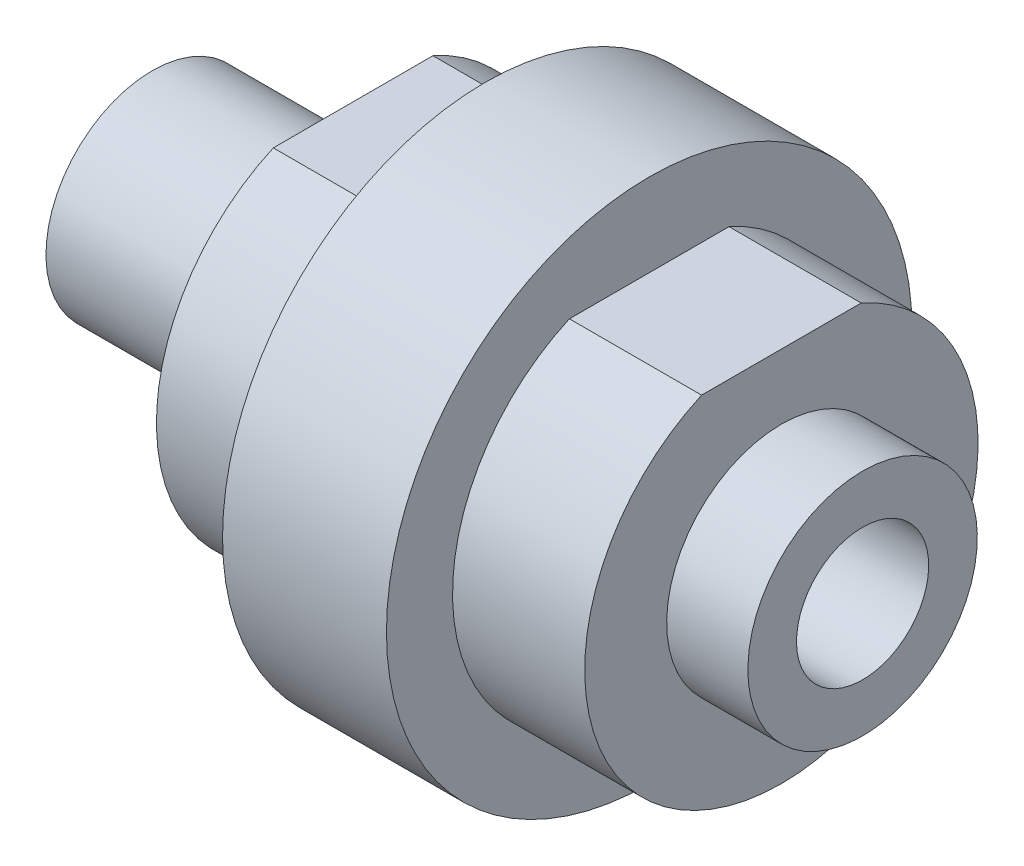
ISO-10303-21;
HEADER;
FILE_DESCRIPTION(('STEP AP214'),'2;1');
FILE_NAME('part.step','',(''),(''),'','','');
FILE_SCHEMA(('AUTOMOTIVE_DESIGN { 1 0 10303 214 1 1 1 1 }'));
ENDSEC;
DATA;
#1=APPLICATION_CONTEXT('core data for automotive mechanical design processes');
#2=APPLICATION_PROTOCOL_DEFINITION('international standard','automotive_design',2000,#1);
#3=PRODUCT_CONTEXT('',#1,'mechanical');
#4=PRODUCT('Part','Part','',(#3));
#5=PRODUCT_RELATED_PRODUCT_CATEGORY('part','',(#4));
#6=PRODUCT_DEFINITION_FORMATION('','',#4);
#7=PRODUCT_DEFINITION_CONTEXT('part definition',#1,'design');
#8=PRODUCT_DEFINITION('design','',#6,#7);
#9=PRODUCT_DEFINITION_SHAPE('','',#8);
#10=(LENGTH_UNIT() NAMED_UNIT(*) SI_UNIT(.MILLI.,.METRE.));
#11=(NAMED_UNIT(*) PLANE_ANGLE_UNIT() SI_UNIT($,.RADIAN.));
#12=(NAMED_UNIT(*) SI_UNIT($,.STERADIAN.) SOLID_ANGLE_UNIT());
#13=UNCERTAINTY_MEASURE_WITH_UNIT(LENGTH_MEASURE(1.E-05),#10,'distance_accuracy_value','');
#14=(GEOMETRIC_REPRESENTATION_CONTEXT(3) GLOBAL_UNCERTAINTY_ASSIGNED_CONTEXT((#13)) GLOBAL_UNIT_ASSIGNED_CONTEXT((#10,
#11,#12)) REPRESENTATION_CONTEXT('',''));
#15=CARTESIAN_POINT('',(0.,0.,0.));
#16=DIRECTION('',(0.,0.,1.));
#17=DIRECTION('',(1.,0.,0.));
#18=AXIS2_PLACEMENT_3D('',#15,#16,#17);
#19=CARTESIAN_POINT('',(34.12744,0.,0.));
#20=DIRECTION('',(1.,0.,0.));
#21=DIRECTION('',(0.,1.,0.));
#22=AXIS2_PLACEMENT_3D('',#19,#20,#21);
#23=CYLINDRICAL_SURFACE('',#22,3.175);
#24=CARTESIAN_POINT('',(0.,0.,0.));
#25=DIRECTION('',(1.,0.,0.));
#26=DIRECTION('',(0.,1.,0.));
#27=AXIS2_PLACEMENT_3D('',#24,#25,#26);
#28=CIRCLE('',#27,3.175);
#29=CARTESIAN_POINT('',(0.,3.175,0.));
#30=VERTEX_POINT('',#29);
#31=EDGE_CURVE('E147',#30,#30,#28,.T.);
#32=ORIENTED_EDGE('',*,*,#31,.F.);
#33=EDGE_LOOP('',(#32));
#34=FACE_BOUND('',#33,.T.);
#35=CARTESIAN_POINT('',(34.12744,0.,0.));
#36=DIRECTION('',(1.,0.,0.));
#37=DIRECTION('',(0.,1.,0.));
#38=AXIS2_PLACEMENT_3D('',#35,#36,#37);
#39=CIRCLE('',#38,3.175);
#40=CARTESIAN_POINT('',(34.12744,3.175,0.));
#41=VERTEX_POINT('',#40);
#42=EDGE_CURVE('E49',#41,#41,#39,.T.);
#43=ORIENTED_EDGE('',*,*,#42,.T.);
#44=EDGE_LOOP('',(#43));
#45=FACE_BOUND('',#44,.T.);
#46=ADVANCED_FACE('F42',(#34,#45),#23,.F.);
#47=CARTESIAN_POINT('',(34.12744,0.,0.));
#48=DIRECTION('',(-1.,0.,0.));
#49=DIRECTION('',(0.,-1.,0.));
#50=AXIS2_PLACEMENT_3D('',#47,#48,#49);
#51=PLANE('',#50);
#52=ORIENTED_EDGE('',*,*,#42,.F.);
#53=EDGE_LOOP('',(#52));
#54=FACE_BOUND('',#53,.T.);
#55=CARTESIAN_POINT('',(34.12744,0.,0.));
#56=DIRECTION('',(1.,0.,0.));
#57=DIRECTION('',(0.,1.,0.));
#58=AXIS2_PLACEMENT_3D('',#55,#56,#57);
#59=CIRCLE('',#58,5.51180000000001);
#60=CARTESIAN_POINT('',(34.12744,5.51180000000001,0.));
#61=VERTEX_POINT('',#60);
#62=EDGE_CURVE('E117',#61,#61,#59,.T.);
#63=ORIENTED_EDGE('',*,*,#62,.T.);
#64=EDGE_LOOP('',(#63));
#65=FACE_BOUND('',#64,.T.);
#66=ADVANCED_FACE('F123',(#54,#65),#51,.F.);
#67=CARTESIAN_POINT('',(34.12744,0.,0.));
#68=DIRECTION('',(1.,0.,0.));
#69=DIRECTION('',(0.,1.,0.));
#70=AXIS2_PLACEMENT_3D('',#67,#68,#69);
#71=CYLINDRICAL_SURFACE('',#70,5.51180000000001);
#72=ORIENTED_EDGE('',*,*,#62,.F.);
#73=EDGE_LOOP('',(#72));
#74=FACE_BOUND('',#73,.T.);
#75=CARTESIAN_POINT('',(30.226,0.,0.));
#76=DIRECTION('',(1.,0.,0.));
#77=DIRECTION('',(0.,1.,0.));
#78=AXIS2_PLACEMENT_3D('',#75,#76,#77);
#79=CIRCLE('',#78,5.51180000000001);
#80=CARTESIAN_POINT('',(30.226,5.51180000000001,0.));
#81=VERTEX_POINT('',#80);
#82=EDGE_CURVE('E114',#81,#81,#79,.T.);
#83=ORIENTED_EDGE('',*,*,#82,.T.);
#84=EDGE_LOOP('',(#83));
#85=FACE_BOUND('',#84,.T.);
#86=ADVANCED_FACE('F126',(#74,#85),#71,.T.);
#87=CARTESIAN_POINT('',(30.226,0.,0.));
#88=DIRECTION('',(-1.,0.,0.));
#89=DIRECTION('',(0.,-1.,0.));
#90=AXIS2_PLACEMENT_3D('',#87,#88,#89);
#91=PLANE('',#90);
#92=ORIENTED_EDGE('',*,*,#82,.F.);
#93=EDGE_LOOP('',(#92));
#94=FACE_BOUND('',#93,.T.);
#95=CARTESIAN_POINT('',(30.226,0.,0.));
#96=DIRECTION('',(1.,0.,0.));
#97=DIRECTION('',(0.,1.,0.));
#98=AXIS2_PLACEMENT_3D('',#95,#96,#97);
#99=CIRCLE('',#98,9.4488);
#100=CARTESIAN_POINT('',(30.226,8.636,3.83396993206781));
#101=VERTEX_POINT('',#100);
#102=CARTESIAN_POINT('',(30.226,8.636,-3.83396993206781));
#103=VERTEX_POINT('',#102);
#104=EDGE_CURVE('E111',#101,#103,#99,.T.);
#105=ORIENTED_EDGE('',*,*,#104,.T.);
#106=DIRECTION('',(0.,0.,1.));
#107=VECTOR('',#106,1.);
#108=CARTESIAN_POINT('',(30.226,8.636,-12.6238));
#109=LINE('',#108,#107);
#110=EDGE_CURVE('E141',#103,#101,#109,.T.);
#111=ORIENTED_EDGE('',*,*,#110,.T.);
#112=EDGE_LOOP('',(#105,#111));
#113=FACE_BOUND('',#112,.T.);
#114=ADVANCED_FACE('F131',(#94,#113),#91,.F.);
#115=CARTESIAN_POINT('',(34.12744,0.,0.));
#116=DIRECTION('',(1.,0.,0.));
#117=DIRECTION('',(0.,1.,0.));
#118=AXIS2_PLACEMENT_3D('',#115,#116,#117);
#119=CYLINDRICAL_SURFACE('',#118,9.4488);
#120=CARTESIAN_POINT('',(23.876,0.,0.));
#121=DIRECTION('',(1.,0.,0.));
#122=DIRECTION('',(0.,1.,0.));
#123=AXIS2_PLACEMENT_3D('',#120,#121,#122);
#124=CIRCLE('',#123,9.4488);
#125=CARTESIAN_POINT('',(23.876,8.636,3.83396993206781));
#126=VERTEX_POINT('',#125);
#127=CARTESIAN_POINT('',(23.876,8.636,-3.83396993206781));
#128=VERTEX_POINT('',#127);
#129=EDGE_CURVE('E108',#126,#128,#124,.T.);
#130=ORIENTED_EDGE('',*,*,#129,.T.);
#131=DIRECTION('',(1.,0.,0.));
#132=VECTOR('',#131,1.);
#133=CARTESIAN_POINT('',(34.12744,8.636,-3.83396993206781));
#134=LINE('',#133,#132);
#135=EDGE_CURVE('E145',#128,#103,#134,.T.);
#136=ORIENTED_EDGE('',*,*,#135,.T.);
#137=ORIENTED_EDGE('',*,*,#104,.F.);
#138=DIRECTION('',(1.,0.,0.));
#139=VECTOR('',#138,1.);
#140=CARTESIAN_POINT('',(34.12744,8.636,3.83396993206781));
#141=LINE('',#140,#139);
#142=EDGE_CURVE('E93',#101,#126,#141,.F.);
#143=ORIENTED_EDGE('',*,*,#142,.T.);
#144=EDGE_LOOP('',(#130,#136,#137,#143));
#145=FACE_BOUND('',#144,.T.);
#146=ADVANCED_FACE('F137',(#145),#119,.T.);
#147=CARTESIAN_POINT('',(23.876,0.,0.));
#148=DIRECTION('',(-1.,0.,0.));
#149=DIRECTION('',(0.,-1.,0.));
#150=AXIS2_PLACEMENT_3D('',#147,#148,#149);
#151=PLANE('',#150);
#152=ORIENTED_EDGE('',*,*,#129,.F.);
#153=DIRECTION('',(0.,0.,1.));
#154=VECTOR('',#153,1.);
#155=CARTESIAN_POINT('',(23.876,8.636,-12.6238));
#156=LINE('',#155,#154);
#157=EDGE_CURVE('E55',#128,#126,#156,.T.);
#158=ORIENTED_EDGE('',*,*,#157,.F.);
#159=EDGE_LOOP('',(#152,#158));
#160=FACE_BOUND('',#159,.T.);
#161=CARTESIAN_POINT('',(23.876,0.,0.));
#162=DIRECTION('',(1.,0.,0.));
#163=DIRECTION('',(0.,1.,0.));
#164=AXIS2_PLACEMENT_3D('',#161,#162,#163);
#165=CIRCLE('',#164,12.6238);
#166=CARTESIAN_POINT('',(23.876,12.6238,0.));
#167=VERTEX_POINT('',#166);
#168=EDGE_CURVE('E100',#167,#167,#165,.T.);
#169=ORIENTED_EDGE('',*,*,#168,.T.);
#170=EDGE_LOOP('',(#169));
#171=FACE_BOUND('',#170,.T.);
#172=ADVANCED_FACE('F209',(#160,#171),#151,.F.);
#173=CARTESIAN_POINT('',(34.12744,0.,0.));
#174=DIRECTION('',(1.,0.,0.));
#175=DIRECTION('',(0.,1.,0.));
#176=AXIS2_PLACEMENT_3D('',#173,#174,#175);
#177=CYLINDRICAL_SURFACE('',#176,12.6238);
#178=ORIENTED_EDGE('',*,*,#168,.F.);
#179=EDGE_LOOP('',(#178));
#180=FACE_BOUND('',#179,.T.);
#181=CARTESIAN_POINT('',(16.002,0.,0.));
#182=DIRECTION('',(1.,0.,0.));
#183=DIRECTION('',(0.,1.,0.));
#184=AXIS2_PLACEMENT_3D('',#181,#182,#183);
#185=CIRCLE('',#184,12.6238);
#186=CARTESIAN_POINT('',(16.002,12.6238,0.));
#187=VERTEX_POINT('',#186);
#188=EDGE_CURVE('E97',#187,#187,#185,.T.);
#189=ORIENTED_EDGE('',*,*,#188,.T.);
#190=EDGE_LOOP('',(#189));
#191=FACE_BOUND('',#190,.T.);
#192=ADVANCED_FACE('F217',(#180,#191),#177,.T.);
#193=CARTESIAN_POINT('',(16.002,0.,0.));
#194=DIRECTION('',(1.,0.,0.));
#195=DIRECTION('',(0.,1.,0.));
#196=AXIS2_PLACEMENT_3D('',#193,#194,#195);
#197=PLANE('',#196);
#198=DIRECTION('',(0.,0.,1.));
#199=VECTOR('',#198,1.);
#200=CARTESIAN_POINT('',(16.002,8.636,-12.6238));
#201=LINE('',#200,#199);
#202=CARTESIAN_POINT('',(16.002,8.636,-3.83396993206781));
#203=VERTEX_POINT('',#202);
#204=CARTESIAN_POINT('',(16.002,8.636,3.83396993206781));
#205=VERTEX_POINT('',#204);
#206=EDGE_CURVE('E79',#203,#205,#201,.T.);
#207=ORIENTED_EDGE('',*,*,#206,.T.);
#208=CARTESIAN_POINT('',(16.002,0.,0.));
#209=DIRECTION('',(1.,0.,0.));
#210=DIRECTION('',(0.,1.,0.));
#211=AXIS2_PLACEMENT_3D('',#208,#209,#210);
#212=CIRCLE('',#211,9.4488);
#213=EDGE_CURVE('E90',#205,#203,#212,.T.);
#214=ORIENTED_EDGE('',*,*,#213,.T.);
#215=EDGE_LOOP('',(#207,#214));
#216=FACE_BOUND('',#215,.T.);
#217=ORIENTED_EDGE('',*,*,#188,.F.);
#218=EDGE_LOOP('',(#217));
#219=FACE_BOUND('',#218,.T.);
#220=ADVANCED_FACE('F95',(#216,#219),#197,.F.);
#221=CARTESIAN_POINT('',(34.12744,0.,0.));
#222=DIRECTION('',(1.,0.,0.));
#223=DIRECTION('',(0.,1.,0.));
#224=AXIS2_PLACEMENT_3D('',#221,#222,#223);
#225=CYLINDRICAL_SURFACE('',#224,9.4488);
#226=CARTESIAN_POINT('',(9.65199999999999,0.,0.));
#227=DIRECTION('',(1.,0.,0.));
#228=DIRECTION('',(0.,1.,0.));
#229=AXIS2_PLACEMENT_3D('',#226,#227,#228);
#230=CIRCLE('',#229,9.4488);
#231=CARTESIAN_POINT('',(9.65199999999999,8.636,3.83396993206781));
#232=VERTEX_POINT('',#231);
#233=CARTESIAN_POINT('',(9.65199999999999,8.636,-3.83396993206781));
#234=VERTEX_POINT('',#233);
#235=EDGE_CURVE('E92',#232,#234,#230,.T.);
#236=ORIENTED_EDGE('',*,*,#235,.T.);
#237=DIRECTION('',(1.,0.,0.));
#238=VECTOR('',#237,1.);
#239=CARTESIAN_POINT('',(34.12744,8.636,-3.83396993206781));
#240=LINE('',#239,#238);
#241=EDGE_CURVE('E63',#234,#203,#240,.T.);
#242=ORIENTED_EDGE('',*,*,#241,.T.);
#243=ORIENTED_EDGE('',*,*,#213,.F.);
#244=DIRECTION('',(1.,0.,0.));
#245=VECTOR('',#244,1.);
#246=CARTESIAN_POINT('',(34.12744,8.636,3.83396993206781));
#247=LINE('',#246,#245);
#248=EDGE_CURVE('E82',#205,#232,#247,.F.);
#249=ORIENTED_EDGE('',*,*,#248,.T.);
#250=EDGE_LOOP('',(#236,#242,#243,#249));
#251=FACE_BOUND('',#250,.T.);
#252=ADVANCED_FACE('F89',(#251),#225,.T.);
#253=CARTESIAN_POINT('',(9.65199999999999,0.,0.));
#254=DIRECTION('',(1.,0.,0.));
#255=DIRECTION('',(0.,1.,0.));
#256=AXIS2_PLACEMENT_3D('',#253,#254,#255);
#257=PLANE('',#256);
#258=ORIENTED_EDGE('',*,*,#235,.F.);
#259=DIRECTION('',(0.,0.,-1.));
#260=VECTOR('',#259,1.);
#261=CARTESIAN_POINT('',(9.65199999999999,8.636,0.));
#262=LINE('',#261,#260);
#263=EDGE_CURVE('E11',#232,#234,#262,.T.);
#264=ORIENTED_EDGE('',*,*,#263,.T.);
#265=EDGE_LOOP('',(#258,#264));
#266=FACE_BOUND('',#265,.T.);
#267=CARTESIAN_POINT('',(9.65199999999999,0.,0.));
#268=DIRECTION('',(1.,0.,0.));
#269=DIRECTION('',(0.,1.,0.));
#270=AXIS2_PLACEMENT_3D('',#267,#268,#269);
#271=CIRCLE('',#270,5.1054);
#272=CARTESIAN_POINT('',(9.65199999999999,5.1054,0.));
#273=VERTEX_POINT('',#272);
#274=EDGE_CURVE('E102',#273,#273,#271,.T.);
#275=ORIENTED_EDGE('',*,*,#274,.T.);
#276=EDGE_LOOP('',(#275));
#277=FACE_BOUND('',#276,.T.);
#278=ADVANCED_FACE('F158',(#266,#277),#257,.F.);
#279=CARTESIAN_POINT('',(34.12744,0.,0.));
#280=DIRECTION('',(1.,0.,0.));
#281=DIRECTION('',(0.,1.,0.));
#282=AXIS2_PLACEMENT_3D('',#279,#280,#281);
#283=CYLINDRICAL_SURFACE('',#282,5.1054);
#284=ORIENTED_EDGE('',*,*,#274,.F.);
#285=EDGE_LOOP('',(#284));
#286=FACE_BOUND('',#285,.T.);
#287=CARTESIAN_POINT('',(0.,0.,0.));
#288=DIRECTION('',(1.,0.,0.));
#289=DIRECTION('',(0.,1.,0.));
#290=AXIS2_PLACEMENT_3D('',#287,#288,#289);
#291=CIRCLE('',#290,5.1054);
#292=CARTESIAN_POINT('',(0.,5.1054,0.));
#293=VERTEX_POINT('',#292);
#294=EDGE_CURVE('E150',#293,#293,#291,.T.);
#295=ORIENTED_EDGE('',*,*,#294,.T.);
#296=EDGE_LOOP('',(#295));
#297=FACE_BOUND('',#296,.T.);
#298=ADVANCED_FACE('F160',(#286,#297),#283,.T.);
#299=CARTESIAN_POINT('',(0.,0.,0.));
#300=DIRECTION('',(1.,0.,0.));
#301=DIRECTION('',(0.,1.,0.));
#302=AXIS2_PLACEMENT_3D('',#299,#300,#301);
#303=PLANE('',#302);
#304=ORIENTED_EDGE('',*,*,#294,.F.);
#305=EDGE_LOOP('',(#304));
#306=FACE_BOUND('',#305,.T.);
#307=ORIENTED_EDGE('',*,*,#31,.T.);
#308=EDGE_LOOP('',(#307));
#309=FACE_BOUND('',#308,.T.);
#310=ADVANCED_FACE('F163',(#306,#309),#303,.F.);
#311=CARTESIAN_POINT('',(9.65199999999999,8.636,-12.6238));
#312=DIRECTION('',(0.,-1.,0.));
#313=DIRECTION('',(0.,0.,-1.));
#314=AXIS2_PLACEMENT_3D('',#311,#312,#313);
#315=PLANE('',#314);
#316=ORIENTED_EDGE('',*,*,#263,.F.);
#317=ORIENTED_EDGE('',*,*,#248,.F.);
#318=ORIENTED_EDGE('',*,*,#206,.F.);
#319=ORIENTED_EDGE('',*,*,#241,.F.);
#320=EDGE_LOOP('',(#316,#317,#318,#319));
#321=FACE_BOUND('',#320,.T.);
#322=ADVANCED_FACE('F80',(#321),#315,.F.);
#323=CARTESIAN_POINT('',(23.876,8.636,-12.6238));
#324=DIRECTION('',(0.,-1.,0.));
#325=DIRECTION('',(0.,0.,-1.));
#326=AXIS2_PLACEMENT_3D('',#323,#324,#325);
#327=PLANE('',#326);
#328=ORIENTED_EDGE('',*,*,#157,.T.);
#329=ORIENTED_EDGE('',*,*,#142,.F.);
#330=ORIENTED_EDGE('',*,*,#110,.F.);
#331=ORIENTED_EDGE('',*,*,#135,.F.);
#332=EDGE_LOOP('',(#328,#329,#330,#331));
#333=FACE_BOUND('',#332,.T.);
#334=ADVANCED_FACE('F253',(#333),#327,.F.);
#335=CLOSED_SHELL('',(#46,#66,#86,#114,#146,#172,#192,#220,#252,#278,#298,#310,#322,#334));
#336=MANIFOLD_SOLID_BREP('B2',#335);
#337=ADVANCED_BREP_SHAPE_REPRESENTATION('',(#18,#336),#14);
#338=SHAPE_DEFINITION_REPRESENTATION(#9,#337);
ENDSEC;
END-ISO-10303-21;
